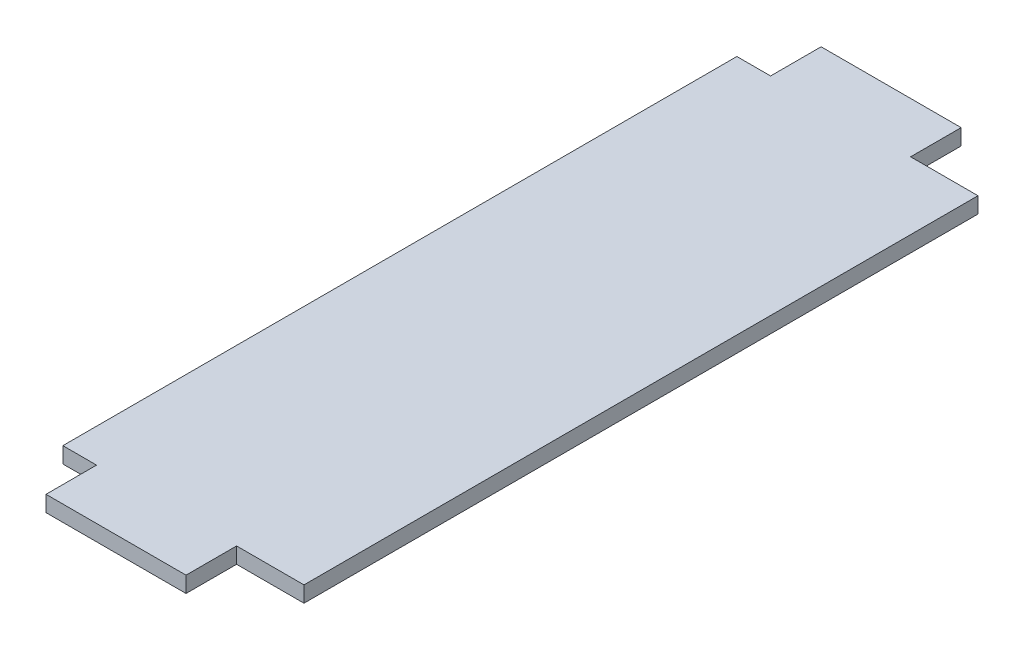
ISO-10303-21;
HEADER;
FILE_DESCRIPTION(('STEP AP214'),'2;1');
FILE_NAME('part.step','',(''),(''),'','','');
FILE_SCHEMA(('AUTOMOTIVE_DESIGN { 1 0 10303 214 1 1 1 1 }'));
ENDSEC;
DATA;
#1=APPLICATION_CONTEXT('core data for automotive mechanical design processes');
#2=APPLICATION_PROTOCOL_DEFINITION('international standard','automotive_design',2000,#1);
#3=PRODUCT_CONTEXT('',#1,'mechanical');
#4=PRODUCT('Part','Part','',(#3));
#5=PRODUCT_RELATED_PRODUCT_CATEGORY('part','',(#4));
#6=PRODUCT_DEFINITION_FORMATION('','',#4);
#7=PRODUCT_DEFINITION_CONTEXT('part definition',#1,'design');
#8=PRODUCT_DEFINITION('design','',#6,#7);
#9=PRODUCT_DEFINITION_SHAPE('','',#8);
#10=(LENGTH_UNIT() NAMED_UNIT(*) SI_UNIT(.MILLI.,.METRE.));
#11=(NAMED_UNIT(*) PLANE_ANGLE_UNIT() SI_UNIT($,.RADIAN.));
#12=(NAMED_UNIT(*) SI_UNIT($,.STERADIAN.) SOLID_ANGLE_UNIT());
#13=UNCERTAINTY_MEASURE_WITH_UNIT(LENGTH_MEASURE(1.E-05),#10,'distance_accuracy_value','');
#14=(GEOMETRIC_REPRESENTATION_CONTEXT(3) GLOBAL_UNCERTAINTY_ASSIGNED_CONTEXT((#13)) GLOBAL_UNIT_ASSIGNED_CONTEXT((#10,
#11,#12)) REPRESENTATION_CONTEXT('',''));
#15=CARTESIAN_POINT('',(0.,0.,0.));
#16=DIRECTION('',(0.,0.,1.));
#17=DIRECTION('',(1.,0.,0.));
#18=AXIS2_PLACEMENT_3D('',#15,#16,#17);
#19=CARTESIAN_POINT('',(10.0168456000001,2.9972,0.));
#20=DIRECTION('',(1.,0.,0.));
#21=DIRECTION('',(0.,0.,-1.));
#22=AXIS2_PLACEMENT_3D('',#19,#20,#21);
#23=PLANE('',#22);
#24=DIRECTION('',(0.,0.,1.));
#25=VECTOR('',#24,1.);
#26=CARTESIAN_POINT('',(10.0168456000001,0.,0.));
#27=LINE('',#26,#25);
#28=CARTESIAN_POINT('',(10.0168456000001,0.,-73.025));
#29=VERTEX_POINT('',#28);
#30=CARTESIAN_POINT('',(10.0168456000001,0.,-63.5));
#31=VERTEX_POINT('',#30);
#32=EDGE_CURVE('E155',#29,#31,#27,.T.);
#33=ORIENTED_EDGE('',*,*,#32,.F.);
#34=DIRECTION('',(0.,-1.,0.));
#35=VECTOR('',#34,1.);
#36=CARTESIAN_POINT('',(10.0168456000001,2.9972,-73.025));
#37=LINE('',#36,#35);
#38=CARTESIAN_POINT('',(10.0168456000001,2.9972,-73.025));
#39=VERTEX_POINT('',#38);
#40=EDGE_CURVE('E11',#39,#29,#37,.T.);
#41=ORIENTED_EDGE('',*,*,#40,.F.);
#42=DIRECTION('',(0.,0.,1.));
#43=VECTOR('',#42,1.);
#44=CARTESIAN_POINT('',(10.0168456000001,2.9972,0.));
#45=LINE('',#44,#43);
#46=CARTESIAN_POINT('',(10.0168456000001,2.9972,-63.5));
#47=VERTEX_POINT('',#46);
#48=EDGE_CURVE('E185',#39,#47,#45,.T.);
#49=ORIENTED_EDGE('',*,*,#48,.T.);
#50=DIRECTION('',(0.,-1.,0.));
#51=VECTOR('',#50,1.);
#52=CARTESIAN_POINT('',(10.0168456000001,2.9972,-63.5));
#53=LINE('',#52,#51);
#54=EDGE_CURVE('E98',#47,#31,#53,.T.);
#55=ORIENTED_EDGE('',*,*,#54,.T.);
#56=EDGE_LOOP('',(#33,#41,#49,#55));
#57=FACE_BOUND('',#56,.T.);
#58=ADVANCED_FACE('F36',(#57),#23,.T.);
#59=CARTESIAN_POINT('',(0.,2.9972,-73.025));
#60=DIRECTION('',(0.,0.,1.));
#61=DIRECTION('',(1.,0.,0.));
#62=AXIS2_PLACEMENT_3D('',#59,#60,#61);
#63=PLANE('',#62);
#64=DIRECTION('',(-1.,0.,0.));
#65=VECTOR('',#64,1.);
#66=CARTESIAN_POINT('',(0.,0.,-73.025));
#67=LINE('',#66,#65);
#68=CARTESIAN_POINT('',(-16.3668455999999,0.,-73.025));
#69=VERTEX_POINT('',#68);
#70=EDGE_CURVE('E158',#29,#69,#67,.T.);
#71=ORIENTED_EDGE('',*,*,#70,.T.);
#72=DIRECTION('',(0.,-1.,0.));
#73=VECTOR('',#72,1.);
#74=CARTESIAN_POINT('',(-16.3668455999999,2.9972,-73.025));
#75=LINE('',#74,#73);
#76=CARTESIAN_POINT('',(-16.3668455999999,2.9972,-73.025));
#77=VERTEX_POINT('',#76);
#78=EDGE_CURVE('E44',#77,#69,#75,.T.);
#79=ORIENTED_EDGE('',*,*,#78,.F.);
#80=DIRECTION('',(-1.,0.,0.));
#81=VECTOR('',#80,1.);
#82=CARTESIAN_POINT('',(0.,2.9972,-73.025));
#83=LINE('',#82,#81);
#84=EDGE_CURVE('E226',#39,#77,#83,.T.);
#85=ORIENTED_EDGE('',*,*,#84,.F.);
#86=ORIENTED_EDGE('',*,*,#40,.T.);
#87=EDGE_LOOP('',(#71,#79,#85,#86));
#88=FACE_BOUND('',#87,.T.);
#89=ADVANCED_FACE('F255',(#88),#63,.F.);
#90=CARTESIAN_POINT('',(-16.3668455999999,2.9972,0.));
#91=DIRECTION('',(1.,0.,0.));
#92=DIRECTION('',(0.,0.,-1.));
#93=AXIS2_PLACEMENT_3D('',#90,#91,#92);
#94=PLANE('',#93);
#95=DIRECTION('',(0.,0.,1.));
#96=VECTOR('',#95,1.);
#97=CARTESIAN_POINT('',(-16.3668455999999,0.,0.));
#98=LINE('',#97,#96);
#99=CARTESIAN_POINT('',(-16.3668455999999,0.,-63.5));
#100=VERTEX_POINT('',#99);
#101=EDGE_CURVE('E160',#69,#100,#98,.T.);
#102=ORIENTED_EDGE('',*,*,#101,.T.);
#103=DIRECTION('',(0.,-1.,0.));
#104=VECTOR('',#103,1.);
#105=CARTESIAN_POINT('',(-16.3668455999999,2.9972,-63.5));
#106=LINE('',#105,#104);
#107=CARTESIAN_POINT('',(-16.3668455999999,2.9972,-63.5));
#108=VERTEX_POINT('',#107);
#109=EDGE_CURVE('E199',#108,#100,#106,.T.);
#110=ORIENTED_EDGE('',*,*,#109,.F.);
#111=DIRECTION('',(0.,0.,1.));
#112=VECTOR('',#111,1.);
#113=CARTESIAN_POINT('',(-16.3668455999999,2.9972,0.));
#114=LINE('',#113,#112);
#115=EDGE_CURVE('E207',#77,#108,#114,.T.);
#116=ORIENTED_EDGE('',*,*,#115,.F.);
#117=ORIENTED_EDGE('',*,*,#78,.T.);
#118=EDGE_LOOP('',(#102,#110,#116,#117));
#119=FACE_BOUND('',#118,.T.);
#120=ADVANCED_FACE('F205',(#119),#94,.F.);
#121=CARTESIAN_POINT('',(0.,2.9972,-63.5));
#122=DIRECTION('',(0.,0.,-1.));
#123=DIRECTION('',(-1.,0.,0.));
#124=AXIS2_PLACEMENT_3D('',#121,#122,#123);
#125=PLANE('',#124);
#126=DIRECTION('',(1.,0.,0.));
#127=VECTOR('',#126,1.);
#128=CARTESIAN_POINT('',(0.,0.,-63.5));
#129=LINE('',#128,#127);
#130=CARTESIAN_POINT('',(-22.7168455999999,0.,-63.5));
#131=VERTEX_POINT('',#130);
#132=EDGE_CURVE('E163',#131,#100,#129,.T.);
#133=ORIENTED_EDGE('',*,*,#132,.F.);
#134=DIRECTION('',(0.,-1.,0.));
#135=VECTOR('',#134,1.);
#136=CARTESIAN_POINT('',(-22.7168455999999,2.9972,-63.5));
#137=LINE('',#136,#135);
#138=CARTESIAN_POINT('',(-22.7168455999999,2.9972,-63.5));
#139=VERTEX_POINT('',#138);
#140=EDGE_CURVE('E197',#139,#131,#137,.T.);
#141=ORIENTED_EDGE('',*,*,#140,.F.);
#142=DIRECTION('',(1.,0.,0.));
#143=VECTOR('',#142,1.);
#144=CARTESIAN_POINT('',(0.,2.9972,-63.5));
#145=LINE('',#144,#143);
#146=EDGE_CURVE('E219',#139,#108,#145,.T.);
#147=ORIENTED_EDGE('',*,*,#146,.T.);
#148=ORIENTED_EDGE('',*,*,#109,.T.);
#149=EDGE_LOOP('',(#133,#141,#147,#148));
#150=FACE_BOUND('',#149,.T.);
#151=ADVANCED_FACE('F216',(#150),#125,.T.);
#152=CARTESIAN_POINT('',(-22.7168455999999,2.9972,0.));
#153=DIRECTION('',(-1.,0.,0.));
#154=DIRECTION('',(0.,0.,1.));
#155=AXIS2_PLACEMENT_3D('',#152,#153,#154);
#156=PLANE('',#155);
#157=DIRECTION('',(0.,0.,-1.));
#158=VECTOR('',#157,1.);
#159=CARTESIAN_POINT('',(-22.7168455999999,0.,0.));
#160=LINE('',#159,#158);
#161=CARTESIAN_POINT('',(-22.7168455999999,0.,63.5));
#162=VERTEX_POINT('',#161);
#163=EDGE_CURVE('E166',#162,#131,#160,.T.);
#164=ORIENTED_EDGE('',*,*,#163,.F.);
#165=DIRECTION('',(0.,-1.,0.));
#166=VECTOR('',#165,1.);
#167=CARTESIAN_POINT('',(-22.7168455999999,2.9972,63.5));
#168=LINE('',#167,#166);
#169=CARTESIAN_POINT('',(-22.7168455999999,2.9972,63.5));
#170=VERTEX_POINT('',#169);
#171=EDGE_CURVE('E195',#170,#162,#168,.T.);
#172=ORIENTED_EDGE('',*,*,#171,.F.);
#173=DIRECTION('',(0.,0.,-1.));
#174=VECTOR('',#173,1.);
#175=CARTESIAN_POINT('',(-22.7168455999999,2.9972,0.));
#176=LINE('',#175,#174);
#177=EDGE_CURVE('E222',#170,#139,#176,.T.);
#178=ORIENTED_EDGE('',*,*,#177,.T.);
#179=ORIENTED_EDGE('',*,*,#140,.T.);
#180=EDGE_LOOP('',(#164,#172,#178,#179));
#181=FACE_BOUND('',#180,.T.);
#182=ADVANCED_FACE('F323',(#181),#156,.T.);
#183=CARTESIAN_POINT('',(0.,2.9972,63.5));
#184=DIRECTION('',(0.,0.,-1.));
#185=DIRECTION('',(-1.,0.,0.));
#186=AXIS2_PLACEMENT_3D('',#183,#184,#185);
#187=PLANE('',#186);
#188=DIRECTION('',(1.,0.,0.));
#189=VECTOR('',#188,1.);
#190=CARTESIAN_POINT('',(0.,0.,63.5));
#191=LINE('',#190,#189);
#192=CARTESIAN_POINT('',(-16.3668455999999,0.,63.5));
#193=VERTEX_POINT('',#192);
#194=EDGE_CURVE('E169',#162,#193,#191,.T.);
#195=ORIENTED_EDGE('',*,*,#194,.T.);
#196=DIRECTION('',(0.,-1.,0.));
#197=VECTOR('',#196,1.);
#198=CARTESIAN_POINT('',(-16.3668455999999,2.9972,63.5));
#199=LINE('',#198,#197);
#200=CARTESIAN_POINT('',(-16.3668455999999,2.9972,63.5));
#201=VERTEX_POINT('',#200);
#202=EDGE_CURVE('E193',#201,#193,#199,.T.);
#203=ORIENTED_EDGE('',*,*,#202,.F.);
#204=DIRECTION('',(1.,0.,0.));
#205=VECTOR('',#204,1.);
#206=CARTESIAN_POINT('',(0.,2.9972,63.5));
#207=LINE('',#206,#205);
#208=EDGE_CURVE('E224',#170,#201,#207,.T.);
#209=ORIENTED_EDGE('',*,*,#208,.F.);
#210=ORIENTED_EDGE('',*,*,#171,.T.);
#211=EDGE_LOOP('',(#195,#203,#209,#210));
#212=FACE_BOUND('',#211,.T.);
#213=ADVANCED_FACE('F314',(#212),#187,.F.);
#214=CARTESIAN_POINT('',(-16.3668455999999,2.9972,0.));
#215=DIRECTION('',(-1.,0.,0.));
#216=DIRECTION('',(0.,0.,1.));
#217=AXIS2_PLACEMENT_3D('',#214,#215,#216);
#218=PLANE('',#217);
#219=DIRECTION('',(0.,0.,-1.));
#220=VECTOR('',#219,1.);
#221=CARTESIAN_POINT('',(-16.3668455999999,0.,0.));
#222=LINE('',#221,#220);
#223=CARTESIAN_POINT('',(-16.3668455999999,0.,73.025));
#224=VERTEX_POINT('',#223);
#225=EDGE_CURVE('E172',#224,#193,#222,.T.);
#226=ORIENTED_EDGE('',*,*,#225,.F.);
#227=DIRECTION('',(0.,-1.,0.));
#228=VECTOR('',#227,1.);
#229=CARTESIAN_POINT('',(-16.3668455999999,2.9972,73.025));
#230=LINE('',#229,#228);
#231=CARTESIAN_POINT('',(-16.3668455999999,2.9972,73.025));
#232=VERTEX_POINT('',#231);
#233=EDGE_CURVE('E191',#232,#224,#230,.T.);
#234=ORIENTED_EDGE('',*,*,#233,.F.);
#235=DIRECTION('',(0.,0.,-1.));
#236=VECTOR('',#235,1.);
#237=CARTESIAN_POINT('',(-16.3668455999999,2.9972,0.));
#238=LINE('',#237,#236);
#239=EDGE_CURVE('E231',#232,#201,#238,.T.);
#240=ORIENTED_EDGE('',*,*,#239,.T.);
#241=ORIENTED_EDGE('',*,*,#202,.T.);
#242=EDGE_LOOP('',(#226,#234,#240,#241));
#243=FACE_BOUND('',#242,.T.);
#244=ADVANCED_FACE('F242',(#243),#218,.T.);
#245=CARTESIAN_POINT('',(0.,2.9972,73.025));
#246=DIRECTION('',(0.,0.,1.));
#247=DIRECTION('',(1.,0.,0.));
#248=AXIS2_PLACEMENT_3D('',#245,#246,#247);
#249=PLANE('',#248);
#250=DIRECTION('',(-1.,0.,0.));
#251=VECTOR('',#250,1.);
#252=CARTESIAN_POINT('',(0.,0.,73.025));
#253=LINE('',#252,#251);
#254=CARTESIAN_POINT('',(10.0168456000001,0.,73.025));
#255=VERTEX_POINT('',#254);
#256=EDGE_CURVE('E175',#255,#224,#253,.T.);
#257=ORIENTED_EDGE('',*,*,#256,.F.);
#258=DIRECTION('',(0.,-1.,0.));
#259=VECTOR('',#258,1.);
#260=CARTESIAN_POINT('',(10.0168456000001,2.9972,73.025));
#261=LINE('',#260,#259);
#262=CARTESIAN_POINT('',(10.0168456000001,2.9972,73.025));
#263=VERTEX_POINT('',#262);
#264=EDGE_CURVE('E189',#263,#255,#261,.T.);
#265=ORIENTED_EDGE('',*,*,#264,.F.);
#266=DIRECTION('',(-1.,0.,0.));
#267=VECTOR('',#266,1.);
#268=CARTESIAN_POINT('',(0.,2.9972,73.025));
#269=LINE('',#268,#267);
#270=EDGE_CURVE('E150',#263,#232,#269,.T.);
#271=ORIENTED_EDGE('',*,*,#270,.T.);
#272=ORIENTED_EDGE('',*,*,#233,.T.);
#273=EDGE_LOOP('',(#257,#265,#271,#272));
#274=FACE_BOUND('',#273,.T.);
#275=ADVANCED_FACE('F236',(#274),#249,.T.);
#276=CARTESIAN_POINT('',(10.0168456000001,2.9972,0.));
#277=DIRECTION('',(-1.,0.,0.));
#278=DIRECTION('',(0.,0.,1.));
#279=AXIS2_PLACEMENT_3D('',#276,#277,#278);
#280=PLANE('',#279);
#281=DIRECTION('',(0.,0.,-1.));
#282=VECTOR('',#281,1.);
#283=CARTESIAN_POINT('',(10.0168456000001,0.,0.));
#284=LINE('',#283,#282);
#285=CARTESIAN_POINT('',(10.0168456000001,0.,63.5));
#286=VERTEX_POINT('',#285);
#287=EDGE_CURVE('E178',#255,#286,#284,.T.);
#288=ORIENTED_EDGE('',*,*,#287,.T.);
#289=DIRECTION('',(0.,-1.,0.));
#290=VECTOR('',#289,1.);
#291=CARTESIAN_POINT('',(10.0168456000001,2.9972,63.5));
#292=LINE('',#291,#290);
#293=CARTESIAN_POINT('',(10.0168456000001,2.9972,63.5));
#294=VERTEX_POINT('',#293);
#295=EDGE_CURVE('E138',#294,#286,#292,.T.);
#296=ORIENTED_EDGE('',*,*,#295,.F.);
#297=DIRECTION('',(0.,0.,-1.));
#298=VECTOR('',#297,1.);
#299=CARTESIAN_POINT('',(10.0168456000001,2.9972,0.));
#300=LINE('',#299,#298);
#301=EDGE_CURVE('E147',#263,#294,#300,.T.);
#302=ORIENTED_EDGE('',*,*,#301,.F.);
#303=ORIENTED_EDGE('',*,*,#264,.T.);
#304=EDGE_LOOP('',(#288,#296,#302,#303));
#305=FACE_BOUND('',#304,.T.);
#306=ADVANCED_FACE('F245',(#305),#280,.F.);
#307=CARTESIAN_POINT('',(0.,2.9972,63.5));
#308=DIRECTION('',(0.,0.,1.));
#309=DIRECTION('',(1.,0.,0.));
#310=AXIS2_PLACEMENT_3D('',#307,#308,#309);
#311=PLANE('',#310);
#312=DIRECTION('',(-1.,0.,0.));
#313=VECTOR('',#312,1.);
#314=CARTESIAN_POINT('',(0.,0.,63.5));
#315=LINE('',#314,#313);
#316=CARTESIAN_POINT('',(22.7168456000001,0.,63.5));
#317=VERTEX_POINT('',#316);
#318=EDGE_CURVE('E137',#317,#286,#315,.T.);
#319=ORIENTED_EDGE('',*,*,#318,.F.);
#320=DIRECTION('',(0.,-1.,0.));
#321=VECTOR('',#320,1.);
#322=CARTESIAN_POINT('',(22.7168456000001,2.9972,63.5));
#323=LINE('',#322,#321);
#324=CARTESIAN_POINT('',(22.7168456000001,2.9972,63.5));
#325=VERTEX_POINT('',#324);
#326=EDGE_CURVE('E131',#325,#317,#323,.T.);
#327=ORIENTED_EDGE('',*,*,#326,.F.);
#328=DIRECTION('',(-1.,0.,0.));
#329=VECTOR('',#328,1.);
#330=CARTESIAN_POINT('',(0.,2.9972,63.5));
#331=LINE('',#330,#329);
#332=EDGE_CURVE('E135',#325,#294,#331,.T.);
#333=ORIENTED_EDGE('',*,*,#332,.T.);
#334=ORIENTED_EDGE('',*,*,#295,.T.);
#335=EDGE_LOOP('',(#319,#327,#333,#334));
#336=FACE_BOUND('',#335,.T.);
#337=ADVANCED_FACE('F133',(#336),#311,.T.);
#338=CARTESIAN_POINT('',(22.7168456000001,2.9972,0.));
#339=DIRECTION('',(-1.,0.,0.));
#340=DIRECTION('',(0.,0.,1.));
#341=AXIS2_PLACEMENT_3D('',#338,#339,#340);
#342=PLANE('',#341);
#343=DIRECTION('',(0.,0.,-1.));
#344=VECTOR('',#343,1.);
#345=CARTESIAN_POINT('',(22.7168456000001,0.,0.));
#346=LINE('',#345,#344);
#347=CARTESIAN_POINT('',(22.7168456000001,0.,-63.5));
#348=VERTEX_POINT('',#347);
#349=EDGE_CURVE('E91',#317,#348,#346,.T.);
#350=ORIENTED_EDGE('',*,*,#349,.T.);
#351=DIRECTION('',(0.,-1.,0.));
#352=VECTOR('',#351,1.);
#353=CARTESIAN_POINT('',(22.7168456000001,2.9972,-63.5));
#354=LINE('',#353,#352);
#355=CARTESIAN_POINT('',(22.7168456000001,2.9972,-63.5));
#356=VERTEX_POINT('',#355);
#357=EDGE_CURVE('E139',#356,#348,#354,.T.);
#358=ORIENTED_EDGE('',*,*,#357,.F.);
#359=DIRECTION('',(0.,0.,-1.));
#360=VECTOR('',#359,1.);
#361=CARTESIAN_POINT('',(22.7168456000001,2.9972,0.));
#362=LINE('',#361,#360);
#363=EDGE_CURVE('E141',#325,#356,#362,.T.);
#364=ORIENTED_EDGE('',*,*,#363,.F.);
#365=ORIENTED_EDGE('',*,*,#326,.T.);
#366=EDGE_LOOP('',(#350,#358,#364,#365));
#367=FACE_BOUND('',#366,.T.);
#368=ADVANCED_FACE('F142',(#367),#342,.F.);
#369=CARTESIAN_POINT('',(0.,2.9972,-63.5));
#370=DIRECTION('',(0.,0.,1.));
#371=DIRECTION('',(1.,0.,0.));
#372=AXIS2_PLACEMENT_3D('',#369,#370,#371);
#373=PLANE('',#372);
#374=DIRECTION('',(-1.,0.,0.));
#375=VECTOR('',#374,1.);
#376=CARTESIAN_POINT('',(0.,0.,-63.5));
#377=LINE('',#376,#375);
#378=EDGE_CURVE('E183',#348,#31,#377,.T.);
#379=ORIENTED_EDGE('',*,*,#378,.T.);
#380=ORIENTED_EDGE('',*,*,#54,.F.);
#381=DIRECTION('',(-1.,0.,0.));
#382=VECTOR('',#381,1.);
#383=CARTESIAN_POINT('',(0.,2.9972,-63.5));
#384=LINE('',#383,#382);
#385=EDGE_CURVE('E52',#356,#47,#384,.T.);
#386=ORIENTED_EDGE('',*,*,#385,.F.);
#387=ORIENTED_EDGE('',*,*,#357,.T.);
#388=EDGE_LOOP('',(#379,#380,#386,#387));
#389=FACE_BOUND('',#388,.T.);
#390=ADVANCED_FACE('F261',(#389),#373,.F.);
#391=CARTESIAN_POINT('',(0.,2.9972,0.));
#392=DIRECTION('',(0.,1.,0.));
#393=DIRECTION('',(0.,0.,1.));
#394=AXIS2_PLACEMENT_3D('',#391,#392,#393);
#395=PLANE('',#394);
#396=ORIENTED_EDGE('',*,*,#48,.F.);
#397=ORIENTED_EDGE('',*,*,#84,.T.);
#398=ORIENTED_EDGE('',*,*,#115,.T.);
#399=ORIENTED_EDGE('',*,*,#146,.F.);
#400=ORIENTED_EDGE('',*,*,#177,.F.);
#401=ORIENTED_EDGE('',*,*,#208,.T.);
#402=ORIENTED_EDGE('',*,*,#239,.F.);
#403=ORIENTED_EDGE('',*,*,#270,.F.);
#404=ORIENTED_EDGE('',*,*,#301,.T.);
#405=ORIENTED_EDGE('',*,*,#332,.F.);
#406=ORIENTED_EDGE('',*,*,#363,.T.);
#407=ORIENTED_EDGE('',*,*,#385,.T.);
#408=EDGE_LOOP('',(#396,#397,#398,#399,#400,#401,#402,#403,#404,#405,#406,#407));
#409=FACE_BOUND('',#408,.T.);
#410=ADVANCED_FACE('F144',(#409),#395,.T.);
#411=CARTESIAN_POINT('',(0.,0.,0.));
#412=DIRECTION('',(0.,1.,0.));
#413=DIRECTION('',(0.,0.,1.));
#414=AXIS2_PLACEMENT_3D('',#411,#412,#413);
#415=PLANE('',#414);
#416=ORIENTED_EDGE('',*,*,#32,.T.);
#417=ORIENTED_EDGE('',*,*,#378,.F.);
#418=ORIENTED_EDGE('',*,*,#349,.F.);
#419=ORIENTED_EDGE('',*,*,#318,.T.);
#420=ORIENTED_EDGE('',*,*,#287,.F.);
#421=ORIENTED_EDGE('',*,*,#256,.T.);
#422=ORIENTED_EDGE('',*,*,#225,.T.);
#423=ORIENTED_EDGE('',*,*,#194,.F.);
#424=ORIENTED_EDGE('',*,*,#163,.T.);
#425=ORIENTED_EDGE('',*,*,#132,.T.);
#426=ORIENTED_EDGE('',*,*,#101,.F.);
#427=ORIENTED_EDGE('',*,*,#70,.F.);
#428=EDGE_LOOP('',(#416,#417,#418,#419,#420,#421,#422,#423,#424,#425,#426,#427));
#429=FACE_BOUND('',#428,.T.);
#430=ADVANCED_FACE('F211',(#429),#415,.F.);
#431=CLOSED_SHELL('',(#58,#89,#120,#151,#182,#213,#244,#275,#306,#337,#368,#390,#410,#430));
#432=MANIFOLD_SOLID_BREP('B2',#431);
#433=ADVANCED_BREP_SHAPE_REPRESENTATION('',(#18,#432),#14);
#434=SHAPE_DEFINITION_REPRESENTATION(#9,#433);
ENDSEC;
END-ISO-10303-21;
